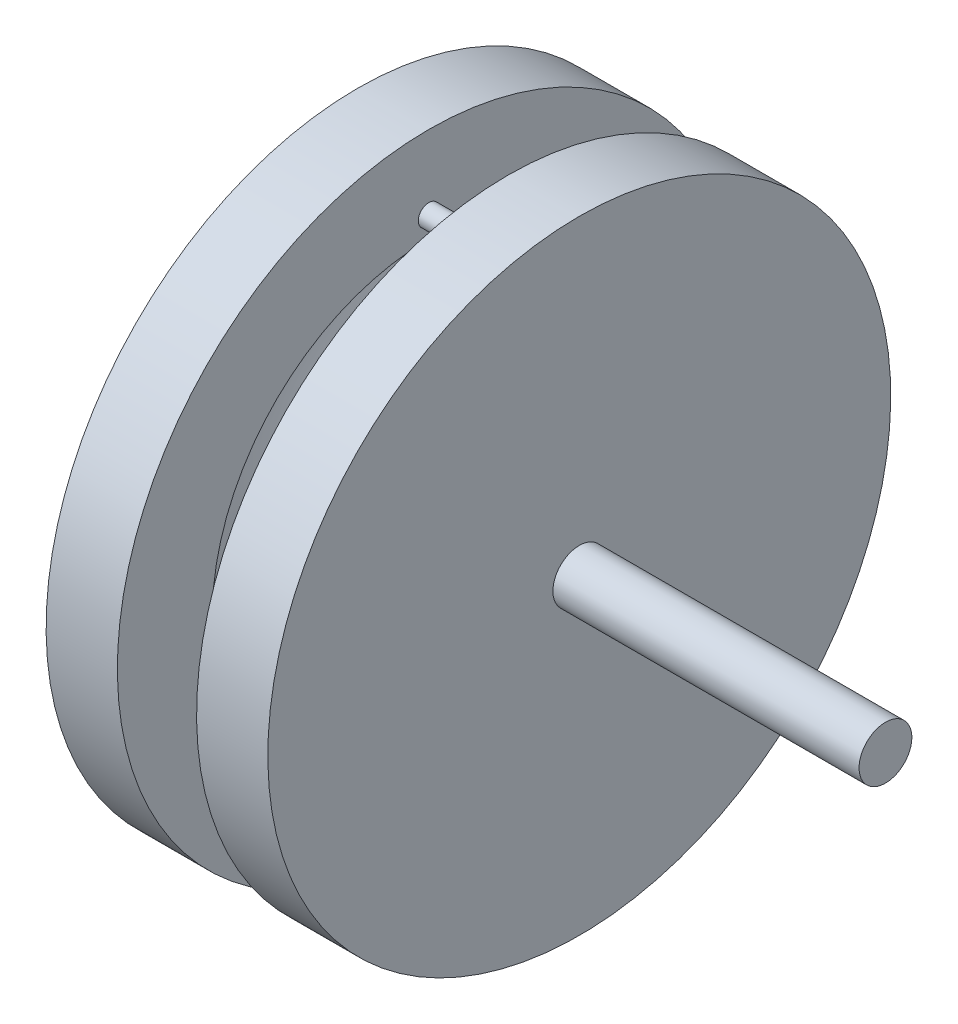
ISO-10303-21;
HEADER;
FILE_DESCRIPTION(('STEP AP214'),'2;1');
FILE_NAME('part.step','',(''),(''),'','','');
FILE_SCHEMA(('AUTOMOTIVE_DESIGN { 1 0 10303 214 1 1 1 1 }'));
ENDSEC;
DATA;
#1=APPLICATION_CONTEXT('core data for automotive mechanical design processes');
#2=APPLICATION_PROTOCOL_DEFINITION('international standard','automotive_design',2000,#1);
#3=PRODUCT_CONTEXT('',#1,'mechanical');
#4=PRODUCT('Part','Part','',(#3));
#5=PRODUCT_RELATED_PRODUCT_CATEGORY('part','',(#4));
#6=PRODUCT_DEFINITION_FORMATION('','',#4);
#7=PRODUCT_DEFINITION_CONTEXT('part definition',#1,'design');
#8=PRODUCT_DEFINITION('design','',#6,#7);
#9=PRODUCT_DEFINITION_SHAPE('','',#8);
#10=(LENGTH_UNIT() NAMED_UNIT(*) SI_UNIT(.MILLI.,.METRE.));
#11=(NAMED_UNIT(*) PLANE_ANGLE_UNIT() SI_UNIT($,.RADIAN.));
#12=(NAMED_UNIT(*) SI_UNIT($,.STERADIAN.) SOLID_ANGLE_UNIT());
#13=UNCERTAINTY_MEASURE_WITH_UNIT(LENGTH_MEASURE(1.E-05),#10,'distance_accuracy_value','');
#14=(GEOMETRIC_REPRESENTATION_CONTEXT(3) GLOBAL_UNCERTAINTY_ASSIGNED_CONTEXT((#13)) GLOBAL_UNIT_ASSIGNED_CONTEXT((#10,
#11,#12)) REPRESENTATION_CONTEXT('',''));
#15=CARTESIAN_POINT('',(0.,0.,0.));
#16=DIRECTION('',(0.,0.,1.));
#17=DIRECTION('',(1.,0.,0.));
#18=AXIS2_PLACEMENT_3D('',#15,#16,#17);
#19=CARTESIAN_POINT('',(-14.25,20.5,0.));
#20=CARTESIAN_POINT('',(-10.2710979280577,9.25455799424791,0.));
#21=CARTESIAN_POINT('',(-6.75,21.,0.));
#22=B_SPLINE_CURVE_WITH_KNOTS('',2,(#19,#20,#21),.UNSPECIFIED.,.F.,.F.,(3,3),(0.,1.),.UNSPECIFIED.);
#23=CARTESIAN_POINT('',(0.,0.,0.));
#24=DIRECTION('',(1.,0.,0.));
#25=AXIS1_PLACEMENT('',#23,#24);
#26=SURFACE_OF_REVOLUTION('',#22,#25);
#27=CARTESIAN_POINT('',(-6.75,0.,0.));
#28=DIRECTION('',(1.,0.,0.));
#29=DIRECTION('',(0.,1.,0.));
#30=AXIS2_PLACEMENT_3D('',#27,#28,#29);
#31=CIRCLE('',#30,21.);
#32=CARTESIAN_POINT('',(-6.75,21.,0.));
#33=VERTEX_POINT('',#32);
#34=EDGE_CURVE('E61',#33,#33,#31,.T.);
#35=ORIENTED_EDGE('',*,*,#34,.F.);
#36=EDGE_LOOP('',(#35));
#37=FACE_BOUND('',#36,.T.);
#38=CARTESIAN_POINT('',(-14.25,0.,0.));
#39=DIRECTION('',(1.,0.,0.));
#40=DIRECTION('',(0.,1.,0.));
#41=AXIS2_PLACEMENT_3D('',#38,#39,#40);
#42=CIRCLE('',#41,20.5);
#43=CARTESIAN_POINT('',(-14.25,20.5,0.));
#44=VERTEX_POINT('',#43);
#45=EDGE_CURVE('E56',#44,#44,#42,.T.);
#46=ORIENTED_EDGE('',*,*,#45,.T.);
#47=EDGE_LOOP('',(#46));
#48=FACE_BOUND('',#47,.T.);
#49=ADVANCED_FACE('F41',(#37,#48),#26,.T.);
#50=CARTESIAN_POINT('',(-14.25,0.,0.));
#51=DIRECTION('',(-1.,0.,0.));
#52=DIRECTION('',(0.,-1.,0.));
#53=AXIS2_PLACEMENT_3D('',#50,#51,#52);
#54=PLANE('',#53);
#55=CARTESIAN_POINT('',(-14.25,-22.5,0.));
#56=DIRECTION('',(-1.,0.,0.));
#57=DIRECTION('',(0.,-1.,0.));
#58=AXIS2_PLACEMENT_3D('',#55,#56,#57);
#59=CIRCLE('',#58,1.);
#60=CARTESIAN_POINT('',(-14.25,-23.5,0.));
#61=VERTEX_POINT('',#60);
#62=EDGE_CURVE('E10',#61,#61,#59,.F.);
#63=ORIENTED_EDGE('',*,*,#62,.F.);
#64=EDGE_LOOP('',(#63));
#65=FACE_BOUND('',#64,.T.);
#66=CARTESIAN_POINT('',(-14.25,22.5,0.));
#67=DIRECTION('',(-1.,0.,0.));
#68=DIRECTION('',(0.,-1.,0.));
#69=AXIS2_PLACEMENT_3D('',#66,#67,#68);
#70=CIRCLE('',#69,1.);
#71=CARTESIAN_POINT('',(-14.25,21.5,0.));
#72=VERTEX_POINT('',#71);
#73=EDGE_CURVE('E58',#72,#72,#70,.T.);
#74=ORIENTED_EDGE('',*,*,#73,.T.);
#75=EDGE_LOOP('',(#74));
#76=FACE_BOUND('',#75,.T.);
#77=ORIENTED_EDGE('',*,*,#45,.F.);
#78=EDGE_LOOP('',(#77));
#79=FACE_BOUND('',#78,.T.);
#80=CARTESIAN_POINT('',(-14.25,0.,0.));
#81=DIRECTION('',(1.,0.,0.));
#82=DIRECTION('',(0.,1.,0.));
#83=AXIS2_PLACEMENT_3D('',#80,#81,#82);
#84=CIRCLE('',#83,29.5);
#85=CARTESIAN_POINT('',(-14.25,29.5,0.));
#86=VERTEX_POINT('',#85);
#87=EDGE_CURVE('E92',#86,#86,#84,.T.);
#88=ORIENTED_EDGE('',*,*,#87,.T.);
#89=EDGE_LOOP('',(#88));
#90=FACE_BOUND('',#89,.T.);
#91=ADVANCED_FACE('F101',(#65,#76,#79,#90),#54,.F.);
#92=CARTESIAN_POINT('',(0.,0.,0.));
#93=DIRECTION('',(1.,0.,0.));
#94=DIRECTION('',(0.,1.,0.));
#95=AXIS2_PLACEMENT_3D('',#92,#93,#94);
#96=CYLINDRICAL_SURFACE('',#95,29.5);
#97=ORIENTED_EDGE('',*,*,#87,.F.);
#98=EDGE_LOOP('',(#97));
#99=FACE_BOUND('',#98,.T.);
#100=CARTESIAN_POINT('',(-21.,0.,0.));
#101=DIRECTION('',(1.,0.,0.));
#102=DIRECTION('',(0.,1.,0.));
#103=AXIS2_PLACEMENT_3D('',#100,#101,#102);
#104=CIRCLE('',#103,29.5);
#105=CARTESIAN_POINT('',(-21.,29.5,0.));
#106=VERTEX_POINT('',#105);
#107=EDGE_CURVE('E88',#106,#106,#104,.T.);
#108=ORIENTED_EDGE('',*,*,#107,.T.);
#109=EDGE_LOOP('',(#108));
#110=FACE_BOUND('',#109,.T.);
#111=ADVANCED_FACE('F104',(#99,#110),#96,.T.);
#112=CARTESIAN_POINT('',(-21.,0.,0.));
#113=DIRECTION('',(1.,0.,0.));
#114=DIRECTION('',(0.,1.,0.));
#115=AXIS2_PLACEMENT_3D('',#112,#113,#114);
#116=PLANE('',#115);
#117=ORIENTED_EDGE('',*,*,#107,.F.);
#118=EDGE_LOOP('',(#117));
#119=FACE_BOUND('',#118,.T.);
#120=ADVANCED_FACE('F110',(#119),#116,.F.);
#121=CARTESIAN_POINT('',(29.,0.,0.));
#122=DIRECTION('',(-1.,0.,0.));
#123=DIRECTION('',(0.,-1.,0.));
#124=AXIS2_PLACEMENT_3D('',#121,#122,#123);
#125=PLANE('',#124);
#126=CARTESIAN_POINT('',(29.,0.,0.));
#127=DIRECTION('',(1.,0.,0.));
#128=DIRECTION('',(0.,1.,0.));
#129=AXIS2_PLACEMENT_3D('',#126,#127,#128);
#130=CIRCLE('',#129,2.49999999999999);
#131=CARTESIAN_POINT('',(29.,2.5,0.));
#132=VERTEX_POINT('',#131);
#133=EDGE_CURVE('E84',#132,#132,#130,.T.);
#134=ORIENTED_EDGE('',*,*,#133,.T.);
#135=EDGE_LOOP('',(#134));
#136=FACE_BOUND('',#135,.T.);
#137=ADVANCED_FACE('F115',(#136),#125,.F.);
#138=CARTESIAN_POINT('',(0.,0.,0.));
#139=DIRECTION('',(1.,0.,0.));
#140=DIRECTION('',(0.,1.,0.));
#141=AXIS2_PLACEMENT_3D('',#138,#139,#140);
#142=CYLINDRICAL_SURFACE('',#141,2.5);
#143=ORIENTED_EDGE('',*,*,#133,.F.);
#144=EDGE_LOOP('',(#143));
#145=FACE_BOUND('',#144,.T.);
#146=CARTESIAN_POINT('',(0.,0.,0.));
#147=DIRECTION('',(1.,0.,0.));
#148=DIRECTION('',(0.,1.,0.));
#149=AXIS2_PLACEMENT_3D('',#146,#147,#148);
#150=CIRCLE('',#149,2.5);
#151=CARTESIAN_POINT('',(0.,2.5,0.));
#152=VERTEX_POINT('',#151);
#153=EDGE_CURVE('E80',#152,#152,#150,.T.);
#154=ORIENTED_EDGE('',*,*,#153,.T.);
#155=EDGE_LOOP('',(#154));
#156=FACE_BOUND('',#155,.T.);
#157=ADVANCED_FACE('F120',(#145,#156),#142,.T.);
#158=CARTESIAN_POINT('',(0.,0.,0.));
#159=DIRECTION('',(-1.,0.,0.));
#160=DIRECTION('',(0.,-1.,0.));
#161=AXIS2_PLACEMENT_3D('',#158,#159,#160);
#162=PLANE('',#161);
#163=ORIENTED_EDGE('',*,*,#153,.F.);
#164=EDGE_LOOP('',(#163));
#165=FACE_BOUND('',#164,.T.);
#166=CARTESIAN_POINT('',(0.,0.,0.));
#167=DIRECTION('',(1.,0.,0.));
#168=DIRECTION('',(0.,1.,0.));
#169=AXIS2_PLACEMENT_3D('',#166,#167,#168);
#170=CIRCLE('',#169,29.5);
#171=CARTESIAN_POINT('',(0.,29.5,0.));
#172=VERTEX_POINT('',#171);
#173=EDGE_CURVE('E76',#172,#172,#170,.T.);
#174=ORIENTED_EDGE('',*,*,#173,.T.);
#175=EDGE_LOOP('',(#174));
#176=FACE_BOUND('',#175,.T.);
#177=ADVANCED_FACE('F140',(#165,#176),#162,.F.);
#178=CARTESIAN_POINT('',(0.,0.,0.));
#179=DIRECTION('',(1.,0.,0.));
#180=DIRECTION('',(0.,1.,0.));
#181=AXIS2_PLACEMENT_3D('',#178,#179,#180);
#182=CYLINDRICAL_SURFACE('',#181,29.5);
#183=CARTESIAN_POINT('',(-6.75,0.,0.));
#184=DIRECTION('',(1.,0.,0.));
#185=DIRECTION('',(0.,1.,0.));
#186=AXIS2_PLACEMENT_3D('',#183,#184,#185);
#187=CIRCLE('',#186,29.5);
#188=CARTESIAN_POINT('',(-6.75,29.5,0.));
#189=VERTEX_POINT('',#188);
#190=EDGE_CURVE('E72',#189,#189,#187,.T.);
#191=ORIENTED_EDGE('',*,*,#190,.T.);
#192=EDGE_LOOP('',(#191));
#193=FACE_BOUND('',#192,.T.);
#194=ORIENTED_EDGE('',*,*,#173,.F.);
#195=EDGE_LOOP('',(#194));
#196=FACE_BOUND('',#195,.T.);
#197=ADVANCED_FACE('F133',(#193,#196),#182,.T.);
#198=CARTESIAN_POINT('',(-6.75,0.,0.));
#199=DIRECTION('',(-1.,0.,0.));
#200=DIRECTION('',(0.,-1.,0.));
#201=AXIS2_PLACEMENT_3D('',#198,#199,#200);
#202=PLANE('',#201);
#203=CARTESIAN_POINT('',(-6.74999999999999,-22.5,0.));
#204=DIRECTION('',(-1.,0.,0.));
#205=DIRECTION('',(0.,-1.,0.));
#206=AXIS2_PLACEMENT_3D('',#203,#204,#205);
#207=CIRCLE('',#206,1.);
#208=CARTESIAN_POINT('',(-6.74999999999999,-23.5,0.));
#209=VERTEX_POINT('',#208);
#210=EDGE_CURVE('E45',#209,#209,#207,.F.);
#211=ORIENTED_EDGE('',*,*,#210,.T.);
#212=EDGE_LOOP('',(#211));
#213=FACE_BOUND('',#212,.T.);
#214=CARTESIAN_POINT('',(-6.75,22.5,0.));
#215=DIRECTION('',(-1.,0.,0.));
#216=DIRECTION('',(0.,-1.,0.));
#217=AXIS2_PLACEMENT_3D('',#214,#215,#216);
#218=CIRCLE('',#217,1.);
#219=CARTESIAN_POINT('',(-6.75,21.5,0.));
#220=VERTEX_POINT('',#219);
#221=EDGE_CURVE('E50',#220,#220,#218,.T.);
#222=ORIENTED_EDGE('',*,*,#221,.F.);
#223=EDGE_LOOP('',(#222));
#224=FACE_BOUND('',#223,.T.);
#225=ORIENTED_EDGE('',*,*,#34,.T.);
#226=EDGE_LOOP('',(#225));
#227=FACE_BOUND('',#226,.T.);
#228=ORIENTED_EDGE('',*,*,#190,.F.);
#229=EDGE_LOOP('',(#228));
#230=FACE_BOUND('',#229,.T.);
#231=ADVANCED_FACE('F129',(#213,#224,#227,#230),#202,.T.);
#232=CARTESIAN_POINT('',(-20.,22.5,0.));
#233=DIRECTION('',(1.,0.,0.));
#234=DIRECTION('',(0.,0.,-1.));
#235=AXIS2_PLACEMENT_3D('',#232,#233,#234);
#236=CYLINDRICAL_SURFACE('',#235,1.);
#237=ORIENTED_EDGE('',*,*,#221,.T.);
#238=EDGE_LOOP('',(#237));
#239=FACE_BOUND('',#238,.T.);
#240=ORIENTED_EDGE('',*,*,#73,.F.);
#241=EDGE_LOOP('',(#240));
#242=FACE_BOUND('',#241,.T.);
#243=ADVANCED_FACE('F132',(#239,#242),#236,.T.);
#244=CARTESIAN_POINT('',(-20.,-22.5,0.));
#245=DIRECTION('',(1.,0.,0.));
#246=DIRECTION('',(0.,0.,-1.));
#247=AXIS2_PLACEMENT_3D('',#244,#245,#246);
#248=CYLINDRICAL_SURFACE('',#247,1.);
#249=ORIENTED_EDGE('',*,*,#210,.F.);
#250=EDGE_LOOP('',(#249));
#251=FACE_BOUND('',#250,.T.);
#252=ORIENTED_EDGE('',*,*,#62,.T.);
#253=EDGE_LOOP('',(#252));
#254=FACE_BOUND('',#253,.T.);
#255=ADVANCED_FACE('F156',(#251,#254),#248,.T.);
#256=CLOSED_SHELL('',(#49,#91,#111,#120,#137,#157,#177,#197,#231,#243,#255));
#257=MANIFOLD_SOLID_BREP('B2',#256);
#258=ADVANCED_BREP_SHAPE_REPRESENTATION('',(#18,#257),#14);
#259=SHAPE_DEFINITION_REPRESENTATION(#9,#258);
ENDSEC;
END-ISO-10303-21;
